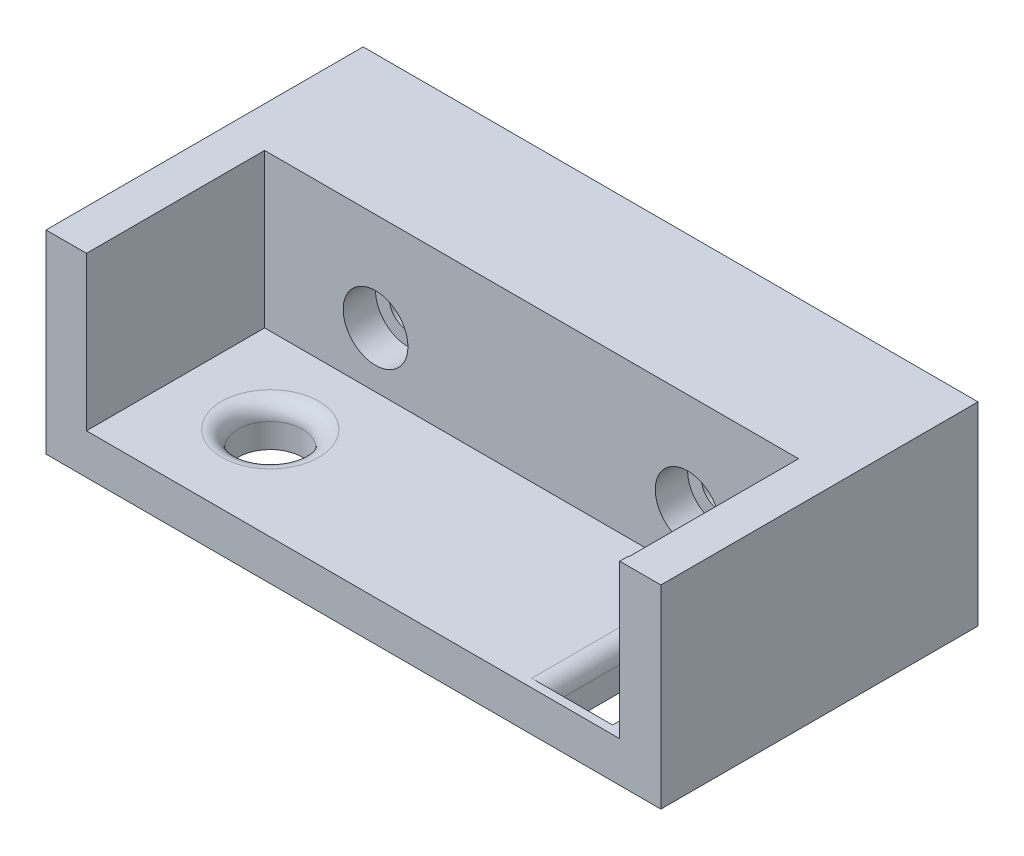
ISO-10303-21;
HEADER;
FILE_DESCRIPTION(('STEP AP214'),'2;1');
FILE_NAME('part.step','',(''),(''),'','','');
FILE_SCHEMA(('AUTOMOTIVE_DESIGN { 1 0 10303 214 1 1 1 1 }'));
ENDSEC;
DATA;
#1=APPLICATION_CONTEXT('core data for automotive mechanical design processes');
#2=APPLICATION_PROTOCOL_DEFINITION('international standard','automotive_design',2000,#1);
#3=PRODUCT_CONTEXT('',#1,'mechanical');
#4=PRODUCT('Part','Part','',(#3));
#5=PRODUCT_RELATED_PRODUCT_CATEGORY('part','',(#4));
#6=PRODUCT_DEFINITION_FORMATION('','',#4);
#7=PRODUCT_DEFINITION_CONTEXT('part definition',#1,'design');
#8=PRODUCT_DEFINITION('design','',#6,#7);
#9=PRODUCT_DEFINITION_SHAPE('','',#8);
#10=(LENGTH_UNIT() NAMED_UNIT(*) SI_UNIT(.MILLI.,.METRE.));
#11=(NAMED_UNIT(*) PLANE_ANGLE_UNIT() SI_UNIT($,.RADIAN.));
#12=(NAMED_UNIT(*) SI_UNIT($,.STERADIAN.) SOLID_ANGLE_UNIT());
#13=UNCERTAINTY_MEASURE_WITH_UNIT(LENGTH_MEASURE(1.E-05),#10,'distance_accuracy_value','');
#14=(GEOMETRIC_REPRESENTATION_CONTEXT(3) GLOBAL_UNCERTAINTY_ASSIGNED_CONTEXT((#13)) GLOBAL_UNIT_ASSIGNED_CONTEXT((#10,
#11,#12)) REPRESENTATION_CONTEXT('',''));
#15=CARTESIAN_POINT('',(0.,0.,0.));
#16=DIRECTION('',(0.,0.,1.));
#17=DIRECTION('',(1.,0.,0.));
#18=AXIS2_PLACEMENT_3D('',#15,#16,#17);
#19=CARTESIAN_POINT('',(-19.2878928169499,6.85176346555883,11.5225387691551));
#20=DIRECTION('',(0.,0.,-1.));
#21=DIRECTION('',(-1.,0.,0.));
#22=AXIS2_PLACEMENT_3D('',#19,#20,#21);
#23=CYLINDRICAL_SURFACE('',#22,2.3);
#24=CARTESIAN_POINT('',(-19.2878928169499,6.85176346555883,-27.6774612308449));
#25=DIRECTION('',(0.,0.,1.));
#26=DIRECTION('',(-1.,0.,0.));
#27=AXIS2_PLACEMENT_3D('',#24,#25,#26);
#28=CIRCLE('',#27,2.3);
#29=CARTESIAN_POINT('',(-21.5878928169499,6.85176346555883,-27.6774612308449));
#30=VERTEX_POINT('',#29);
#31=EDGE_CURVE('E363',#30,#30,#28,.T.);
#32=ORIENTED_EDGE('',*,*,#31,.F.);
#33=EDGE_LOOP('',(#32));
#34=FACE_BOUND('',#33,.T.);
#35=CARTESIAN_POINT('',(-19.2878928169499,6.85176346555883,-14.5));
#36=DIRECTION('',(0.,0.,1.));
#37=DIRECTION('',(1.,0.,0.));
#38=AXIS2_PLACEMENT_3D('',#35,#36,#37);
#39=CIRCLE('',#38,2.3);
#40=CARTESIAN_POINT('',(-16.9878928169499,6.85176346555883,-14.5));
#41=VERTEX_POINT('',#40);
#42=EDGE_CURVE('E44',#41,#41,#39,.T.);
#43=ORIENTED_EDGE('',*,*,#42,.T.);
#44=EDGE_LOOP('',(#43));
#45=FACE_BOUND('',#44,.T.);
#46=ADVANCED_FACE('F40',(#34,#45),#23,.F.);
#47=CARTESIAN_POINT('',(19.2878928169499,6.85176346555883,11.5225387691551));
#48=DIRECTION('',(0.,0.,-1.));
#49=DIRECTION('',(-1.,0.,0.));
#50=AXIS2_PLACEMENT_3D('',#47,#48,#49);
#51=CYLINDRICAL_SURFACE('',#50,2.3);
#52=CARTESIAN_POINT('',(19.2878928169499,6.85176346555883,-27.6774612308449));
#53=DIRECTION('',(0.,0.,1.));
#54=DIRECTION('',(1.,0.,0.));
#55=AXIS2_PLACEMENT_3D('',#52,#53,#54);
#56=CIRCLE('',#55,2.3);
#57=CARTESIAN_POINT('',(21.5878928169499,6.85176346555883,-27.6774612308449));
#58=VERTEX_POINT('',#57);
#59=EDGE_CURVE('E364',#58,#58,#56,.T.);
#60=ORIENTED_EDGE('',*,*,#59,.F.);
#61=EDGE_LOOP('',(#60));
#62=FACE_BOUND('',#61,.T.);
#63=CARTESIAN_POINT('',(19.2878928169499,6.85176346555883,-14.5));
#64=DIRECTION('',(0.,0.,1.));
#65=DIRECTION('',(1.,0.,0.));
#66=AXIS2_PLACEMENT_3D('',#63,#64,#65);
#67=CIRCLE('',#66,2.3);
#68=CARTESIAN_POINT('',(21.5878928169499,6.85176346555883,-14.5));
#69=VERTEX_POINT('',#68);
#70=EDGE_CURVE('E321',#69,#69,#67,.T.);
#71=ORIENTED_EDGE('',*,*,#70,.T.);
#72=EDGE_LOOP('',(#71));
#73=FACE_BOUND('',#72,.T.);
#74=ADVANCED_FACE('F451',(#62,#73),#51,.F.);
#75=CARTESIAN_POINT('',(-33.,19.,10.5));
#76=DIRECTION('',(0.,0.,-1.));
#77=DIRECTION('',(-1.,0.,0.));
#78=AXIS2_PLACEMENT_3D('',#75,#76,#77);
#79=PLANE('',#78);
#80=CARTESIAN_POINT('',(21.,-2.,10.5));
#81=DIRECTION('',(0.,0.,-1.));
#82=DIRECTION('',(-1.,0.,0.));
#83=AXIS2_PLACEMENT_3D('',#80,#81,#82);
#84=CIRCLE('',#83,2.);
#85=CARTESIAN_POINT('',(23.,-2.,10.5));
#86=VERTEX_POINT('',#85);
#87=CARTESIAN_POINT('',(21.,0.,10.5));
#88=VERTEX_POINT('',#87);
#89=EDGE_CURVE('E316',#86,#88,#84,.F.);
#90=ORIENTED_EDGE('',*,*,#89,.T.);
#91=DIRECTION('',(1.,0.,0.));
#92=VECTOR('',#91,1.);
#93=CARTESIAN_POINT('',(-33.,0.,10.5));
#94=LINE('',#93,#92);
#95=CARTESIAN_POINT('',(31.,0.,10.5));
#96=VERTEX_POINT('',#95);
#97=EDGE_CURVE('E350',#88,#96,#94,.T.);
#98=ORIENTED_EDGE('',*,*,#97,.T.);
#99=DIRECTION('',(0.,1.,0.));
#100=VECTOR('',#99,1.);
#101=CARTESIAN_POINT('',(31.,-5.,10.5));
#102=LINE('',#101,#100);
#103=CARTESIAN_POINT('',(31.,-5.,10.5));
#104=VERTEX_POINT('',#103);
#105=EDGE_CURVE('E234',#104,#96,#102,.T.);
#106=ORIENTED_EDGE('',*,*,#105,.F.);
#107=DIRECTION('',(1.,0.,0.));
#108=VECTOR('',#107,1.);
#109=CARTESIAN_POINT('',(23.,-5.,10.5));
#110=LINE('',#109,#108);
#111=CARTESIAN_POINT('',(23.,-5.,10.5));
#112=VERTEX_POINT('',#111);
#113=EDGE_CURVE('E218',#112,#104,#110,.T.);
#114=ORIENTED_EDGE('',*,*,#113,.F.);
#115=DIRECTION('',(0.,1.,0.));
#116=VECTOR('',#115,1.);
#117=CARTESIAN_POINT('',(23.,-5.,10.5));
#118=LINE('',#117,#116);
#119=EDGE_CURVE('E239',#112,#86,#118,.T.);
#120=ORIENTED_EDGE('',*,*,#119,.T.);
#121=EDGE_LOOP('',(#90,#98,#106,#114,#120));
#122=FACE_BOUND('',#121,.T.);
#123=ADVANCED_FACE('F419',(#122),#79,.T.);
#124=CARTESIAN_POINT('',(0.,0.,0.));
#125=DIRECTION('',(0.,1.,0.));
#126=DIRECTION('',(0.,0.,1.));
#127=AXIS2_PLACEMENT_3D('',#124,#125,#126);
#128=PLANE('',#127);
#129=DIRECTION('',(0.,0.,-1.));
#130=VECTOR('',#129,1.);
#131=CARTESIAN_POINT('',(31.,0.,-12.));
#132=LINE('',#131,#130);
#133=CARTESIAN_POINT('',(31.,0.,-10.5));
#134=VERTEX_POINT('',#133);
#135=CARTESIAN_POINT('',(31.,0.,-12.));
#136=VERTEX_POINT('',#135);
#137=EDGE_CURVE('E227',#134,#136,#132,.T.);
#138=ORIENTED_EDGE('',*,*,#137,.F.);
#139=DIRECTION('',(-1.,0.,0.));
#140=VECTOR('',#139,1.);
#141=CARTESIAN_POINT('',(-33.,0.,-10.5));
#142=LINE('',#141,#140);
#143=CARTESIAN_POINT('',(23.,0.,-10.5));
#144=VERTEX_POINT('',#143);
#145=EDGE_CURVE('E278',#134,#144,#142,.T.);
#146=ORIENTED_EDGE('',*,*,#145,.T.);
#147=DIRECTION('',(0.,0.,1.));
#148=VECTOR('',#147,1.);
#149=CARTESIAN_POINT('',(23.,0.,-12.));
#150=LINE('',#149,#148);
#151=CARTESIAN_POINT('',(23.,0.,-12.));
#152=VERTEX_POINT('',#151);
#153=EDGE_CURVE('E210',#152,#144,#150,.T.);
#154=ORIENTED_EDGE('',*,*,#153,.F.);
#155=DIRECTION('',(-1.,0.,0.));
#156=VECTOR('',#155,1.);
#157=CARTESIAN_POINT('',(23.,0.,-12.));
#158=LINE('',#157,#156);
#159=EDGE_CURVE('E226',#136,#152,#158,.T.);
#160=ORIENTED_EDGE('',*,*,#159,.F.);
#161=EDGE_LOOP('',(#138,#146,#154,#160));
#162=FACE_BOUND('',#161,.T.);
#163=ADVANCED_FACE('F430',(#162),#128,.F.);
#164=CARTESIAN_POINT('',(0.,19.,0.));
#165=DIRECTION('',(0.,1.,0.));
#166=DIRECTION('',(0.,0.,1.));
#167=AXIS2_PLACEMENT_3D('',#164,#165,#166);
#168=PLANE('',#167);
#169=DIRECTION('',(-1.,0.,0.));
#170=VECTOR('',#169,1.);
#171=CARTESIAN_POINT('',(-38.,19.,11.5225387691551));
#172=LINE('',#171,#170);
#173=CARTESIAN_POINT('',(-33.,19.,11.5225387691551));
#174=VERTEX_POINT('',#173);
#175=CARTESIAN_POINT('',(-38.,19.,11.5225387691551));
#176=VERTEX_POINT('',#175);
#177=EDGE_CURVE('E174',#174,#176,#172,.T.);
#178=ORIENTED_EDGE('',*,*,#177,.F.);
#179=DIRECTION('',(0.,0.,1.));
#180=VECTOR('',#179,1.);
#181=CARTESIAN_POINT('',(-33.,19.,-10.5));
#182=LINE('',#181,#180);
#183=CARTESIAN_POINT('',(-33.,19.,-10.5));
#184=VERTEX_POINT('',#183);
#185=EDGE_CURVE('E159',#184,#174,#182,.T.);
#186=ORIENTED_EDGE('',*,*,#185,.F.);
#187=DIRECTION('',(-1.,0.,0.));
#188=VECTOR('',#187,1.);
#189=CARTESIAN_POINT('',(-33.,19.,-10.5));
#190=LINE('',#189,#188);
#191=CARTESIAN_POINT('',(33.,19.,-10.5));
#192=VERTEX_POINT('',#191);
#193=EDGE_CURVE('E171',#192,#184,#190,.T.);
#194=ORIENTED_EDGE('',*,*,#193,.F.);
#195=DIRECTION('',(0.,0.,-1.));
#196=VECTOR('',#195,1.);
#197=CARTESIAN_POINT('',(33.,19.,-10.5));
#198=LINE('',#197,#196);
#199=CARTESIAN_POINT('',(33.,19.,10.5));
#200=VERTEX_POINT('',#199);
#201=EDGE_CURVE('E261',#200,#192,#198,.T.);
#202=ORIENTED_EDGE('',*,*,#201,.F.);
#203=DIRECTION('',(1.,0.,0.));
#204=VECTOR('',#203,1.);
#205=CARTESIAN_POINT('',(-33.,19.,10.5));
#206=LINE('',#205,#204);
#207=CARTESIAN_POINT('',(32.9119548306093,19.,10.5));
#208=VERTEX_POINT('',#207);
#209=EDGE_CURVE('E170',#208,#200,#206,.T.);
#210=ORIENTED_EDGE('',*,*,#209,.F.);
#211=DIRECTION('',(0.,0.,-1.));
#212=VECTOR('',#211,1.);
#213=CARTESIAN_POINT('',(32.9119548306093,19.,10.5));
#214=LINE('',#213,#212);
#215=CARTESIAN_POINT('',(32.9119548306093,19.,11.5225387691551));
#216=VERTEX_POINT('',#215);
#217=EDGE_CURVE('E179',#216,#208,#214,.T.);
#218=ORIENTED_EDGE('',*,*,#217,.F.);
#219=CARTESIAN_POINT('',(38.,19.,11.5225387691551));
#220=VERTEX_POINT('',#219);
#221=EDGE_CURVE('E186',#220,#216,#172,.T.);
#222=ORIENTED_EDGE('',*,*,#221,.F.);
#223=DIRECTION('',(0.,0.,-1.));
#224=VECTOR('',#223,1.);
#225=CARTESIAN_POINT('',(38.,19.,-15.5));
#226=LINE('',#225,#224);
#227=CARTESIAN_POINT('',(38.,19.,-27.6774612308449));
#228=VERTEX_POINT('',#227);
#229=EDGE_CURVE('E292',#220,#228,#226,.T.);
#230=ORIENTED_EDGE('',*,*,#229,.T.);
#231=DIRECTION('',(-1.,0.,0.));
#232=VECTOR('',#231,1.);
#233=CARTESIAN_POINT('',(-38.,19.,-27.6774612308449));
#234=LINE('',#233,#232);
#235=CARTESIAN_POINT('',(-38.,19.,-27.6774612308449));
#236=VERTEX_POINT('',#235);
#237=EDGE_CURVE('E187',#228,#236,#234,.T.);
#238=ORIENTED_EDGE('',*,*,#237,.T.);
#239=DIRECTION('',(0.,0.,1.));
#240=VECTOR('',#239,1.);
#241=CARTESIAN_POINT('',(-38.,19.,-15.5));
#242=LINE('',#241,#240);
#243=EDGE_CURVE('E184',#236,#176,#242,.T.);
#244=ORIENTED_EDGE('',*,*,#243,.T.);
#245=EDGE_LOOP('',(#178,#186,#194,#202,#210,#218,#222,#230,#238,#244));
#246=FACE_BOUND('',#245,.T.);
#247=ADVANCED_FACE('F182',(#246),#168,.T.);
#248=CARTESIAN_POINT('',(38.,19.,-15.5));
#249=DIRECTION('',(-1.,0.,0.));
#250=DIRECTION('',(0.,0.,1.));
#251=AXIS2_PLACEMENT_3D('',#248,#249,#250);
#252=PLANE('',#251);
#253=ORIENTED_EDGE('',*,*,#229,.F.);
#254=DIRECTION('',(0.,-1.,0.));
#255=VECTOR('',#254,1.);
#256=CARTESIAN_POINT('',(38.,19.,11.5225387691551));
#257=LINE('',#256,#255);
#258=CARTESIAN_POINT('',(38.,-5.,11.5225387691551));
#259=VERTEX_POINT('',#258);
#260=EDGE_CURVE('E200',#220,#259,#257,.T.);
#261=ORIENTED_EDGE('',*,*,#260,.T.);
#262=DIRECTION('',(0.,0.,-1.));
#263=VECTOR('',#262,1.);
#264=CARTESIAN_POINT('',(38.,-5.,-15.5));
#265=LINE('',#264,#263);
#266=CARTESIAN_POINT('',(38.,-5.,-27.6774612308449));
#267=VERTEX_POINT('',#266);
#268=EDGE_CURVE('E253',#259,#267,#265,.T.);
#269=ORIENTED_EDGE('',*,*,#268,.T.);
#270=DIRECTION('',(0.,1.,0.));
#271=VECTOR('',#270,1.);
#272=CARTESIAN_POINT('',(38.,19.,-27.6774612308449));
#273=LINE('',#272,#271);
#274=EDGE_CURVE('E192',#267,#228,#273,.T.);
#275=ORIENTED_EDGE('',*,*,#274,.T.);
#276=EDGE_LOOP('',(#253,#261,#269,#275));
#277=FACE_BOUND('',#276,.T.);
#278=ADVANCED_FACE('F390',(#277),#252,.F.);
#279=CARTESIAN_POINT('',(-38.,19.,-15.5));
#280=DIRECTION('',(1.,0.,0.));
#281=DIRECTION('',(0.,0.,-1.));
#282=AXIS2_PLACEMENT_3D('',#279,#280,#281);
#283=PLANE('',#282);
#284=DIRECTION('',(0.,0.,1.));
#285=VECTOR('',#284,1.);
#286=CARTESIAN_POINT('',(-38.,-5.,-15.5));
#287=LINE('',#286,#285);
#288=CARTESIAN_POINT('',(-38.,-5.,-27.6774612308449));
#289=VERTEX_POINT('',#288);
#290=CARTESIAN_POINT('',(-38.,-5.,11.5225387691551));
#291=VERTEX_POINT('',#290);
#292=EDGE_CURVE('E256',#289,#291,#287,.T.);
#293=ORIENTED_EDGE('',*,*,#292,.T.);
#294=DIRECTION('',(0.,1.,0.));
#295=VECTOR('',#294,1.);
#296=CARTESIAN_POINT('',(-38.,-5.,11.5225387691551));
#297=LINE('',#296,#295);
#298=EDGE_CURVE('E66',#291,#176,#297,.T.);
#299=ORIENTED_EDGE('',*,*,#298,.T.);
#300=ORIENTED_EDGE('',*,*,#243,.F.);
#301=DIRECTION('',(0.,-1.,0.));
#302=VECTOR('',#301,1.);
#303=CARTESIAN_POINT('',(-38.,19.,-27.6774612308449));
#304=LINE('',#303,#302);
#305=EDGE_CURVE('E196',#236,#289,#304,.T.);
#306=ORIENTED_EDGE('',*,*,#305,.T.);
#307=EDGE_LOOP('',(#293,#299,#300,#306));
#308=FACE_BOUND('',#307,.T.);
#309=ADVANCED_FACE('F384',(#308),#283,.F.);
#310=CARTESIAN_POINT('',(33.,19.,-10.5));
#311=DIRECTION('',(-1.,0.,0.));
#312=DIRECTION('',(0.,0.,1.));
#313=AXIS2_PLACEMENT_3D('',#310,#311,#312);
#314=PLANE('',#313);
#315=DIRECTION('',(0.,0.,-1.));
#316=VECTOR('',#315,1.);
#317=CARTESIAN_POINT('',(33.,0.,-10.5));
#318=LINE('',#317,#316);
#319=CARTESIAN_POINT('',(33.,0.,10.5));
#320=VERTEX_POINT('',#319);
#321=CARTESIAN_POINT('',(33.,0.,-10.5));
#322=VERTEX_POINT('',#321);
#323=EDGE_CURVE('E260',#320,#322,#318,.T.);
#324=ORIENTED_EDGE('',*,*,#323,.F.);
#325=DIRECTION('',(0.,-1.,0.));
#326=VECTOR('',#325,1.);
#327=CARTESIAN_POINT('',(33.,19.,10.5));
#328=LINE('',#327,#326);
#329=EDGE_CURVE('E269',#200,#320,#328,.T.);
#330=ORIENTED_EDGE('',*,*,#329,.F.);
#331=ORIENTED_EDGE('',*,*,#201,.T.);
#332=DIRECTION('',(0.,-1.,0.));
#333=VECTOR('',#332,1.);
#334=CARTESIAN_POINT('',(33.,19.,-10.5));
#335=LINE('',#334,#333);
#336=EDGE_CURVE('E288',#192,#322,#335,.T.);
#337=ORIENTED_EDGE('',*,*,#336,.T.);
#338=EDGE_LOOP('',(#324,#330,#331,#337));
#339=FACE_BOUND('',#338,.T.);
#340=ADVANCED_FACE('F406',(#339),#314,.T.);
#341=CARTESIAN_POINT('',(-33.,19.,-10.5));
#342=DIRECTION('',(0.,0.,1.));
#343=DIRECTION('',(1.,0.,0.));
#344=AXIS2_PLACEMENT_3D('',#341,#342,#343);
#345=PLANE('',#344);
#346=CARTESIAN_POINT('',(-19.2878928169499,6.85176346555883,-10.5));
#347=DIRECTION('',(0.,0.,1.));
#348=DIRECTION('',(1.,0.,0.));
#349=AXIS2_PLACEMENT_3D('',#346,#347,#348);
#350=CIRCLE('',#349,4.);
#351=CARTESIAN_POINT('',(-15.2878928169499,6.85176346555883,-10.5));
#352=VERTEX_POINT('',#351);
#353=EDGE_CURVE('E331',#352,#352,#350,.T.);
#354=ORIENTED_EDGE('',*,*,#353,.F.);
#355=EDGE_LOOP('',(#354));
#356=FACE_BOUND('',#355,.T.);
#357=CARTESIAN_POINT('',(19.2878928169499,6.85176346555883,-10.5));
#358=DIRECTION('',(0.,0.,1.));
#359=DIRECTION('',(1.,0.,0.));
#360=AXIS2_PLACEMENT_3D('',#357,#358,#359);
#361=CIRCLE('',#360,4.);
#362=CARTESIAN_POINT('',(23.2878928169499,6.85176346555883,-10.5));
#363=VERTEX_POINT('',#362);
#364=EDGE_CURVE('E343',#363,#363,#361,.T.);
#365=ORIENTED_EDGE('',*,*,#364,.F.);
#366=EDGE_LOOP('',(#365));
#367=FACE_BOUND('',#366,.T.);
#368=EDGE_CURVE('E274',#322,#134,#142,.T.);
#369=ORIENTED_EDGE('',*,*,#368,.F.);
#370=ORIENTED_EDGE('',*,*,#336,.F.);
#371=ORIENTED_EDGE('',*,*,#193,.T.);
#372=DIRECTION('',(0.,-1.,0.));
#373=VECTOR('',#372,1.);
#374=CARTESIAN_POINT('',(-33.,19.,-10.5));
#375=LINE('',#374,#373);
#376=CARTESIAN_POINT('',(-33.,0.,-10.5));
#377=VERTEX_POINT('',#376);
#378=EDGE_CURVE('E165',#184,#377,#375,.T.);
#379=ORIENTED_EDGE('',*,*,#378,.T.);
#380=CARTESIAN_POINT('',(21.,0.,-10.5));
#381=VERTEX_POINT('',#380);
#382=EDGE_CURVE('E273',#381,#377,#142,.T.);
#383=ORIENTED_EDGE('',*,*,#382,.F.);
#384=CARTESIAN_POINT('',(21.,-2.,-10.5));
#385=DIRECTION('',(0.,0.,1.));
#386=DIRECTION('',(1.,0.,0.));
#387=AXIS2_PLACEMENT_3D('',#384,#385,#386);
#388=CIRCLE('',#387,2.);
#389=CARTESIAN_POINT('',(23.,-2.,-10.5));
#390=VERTEX_POINT('',#389);
#391=EDGE_CURVE('E50',#381,#390,#388,.F.);
#392=ORIENTED_EDGE('',*,*,#391,.T.);
#393=DIRECTION('',(0.,-1.,0.));
#394=VECTOR('',#393,1.);
#395=CARTESIAN_POINT('',(23.,19.,-10.5));
#396=LINE('',#395,#394);
#397=EDGE_CURVE('E305',#144,#390,#396,.T.);
#398=ORIENTED_EDGE('',*,*,#397,.F.);
#399=ORIENTED_EDGE('',*,*,#145,.F.);
#400=EDGE_LOOP('',(#369,#370,#371,#379,#383,#392,#398,#399));
#401=FACE_BOUND('',#400,.T.);
#402=ADVANCED_FACE('F409',(#356,#367,#401),#345,.T.);
#403=CARTESIAN_POINT('',(-33.,19.,-10.5));
#404=DIRECTION('',(1.,0.,0.));
#405=DIRECTION('',(0.,0.,-1.));
#406=AXIS2_PLACEMENT_3D('',#403,#404,#405);
#407=PLANE('',#406);
#408=DIRECTION('',(0.,0.,1.));
#409=VECTOR('',#408,1.);
#410=CARTESIAN_POINT('',(-33.,0.,-10.5));
#411=LINE('',#410,#409);
#412=CARTESIAN_POINT('',(-33.,0.,11.5225387691551));
#413=VERTEX_POINT('',#412);
#414=EDGE_CURVE('E58',#377,#413,#411,.T.);
#415=ORIENTED_EDGE('',*,*,#414,.F.);
#416=ORIENTED_EDGE('',*,*,#378,.F.);
#417=ORIENTED_EDGE('',*,*,#185,.T.);
#418=DIRECTION('',(0.,1.,0.));
#419=VECTOR('',#418,1.);
#420=CARTESIAN_POINT('',(-33.,-65.9198860369669,11.5225387691551));
#421=LINE('',#420,#419);
#422=EDGE_CURVE('E162',#413,#174,#421,.T.);
#423=ORIENTED_EDGE('',*,*,#422,.F.);
#424=EDGE_LOOP('',(#415,#416,#417,#423));
#425=FACE_BOUND('',#424,.T.);
#426=ADVANCED_FACE('F161',(#425),#407,.T.);
#427=DIRECTION('',(0.,1.,0.));
#428=VECTOR('',#427,1.);
#429=CARTESIAN_POINT('',(32.9119548306093,-65.9198860369669,10.5));
#430=LINE('',#429,#428);
#431=CARTESIAN_POINT('',(32.9119548306093,0.,10.5));
#432=VERTEX_POINT('',#431);
#433=EDGE_CURVE('E351',#432,#208,#430,.T.);
#434=ORIENTED_EDGE('',*,*,#433,.T.);
#435=ORIENTED_EDGE('',*,*,#209,.T.);
#436=ORIENTED_EDGE('',*,*,#329,.T.);
#437=DIRECTION('',(1.,0.,0.));
#438=VECTOR('',#437,1.);
#439=CARTESIAN_POINT('',(-33.,0.,10.5));
#440=LINE('',#439,#438);
#441=EDGE_CURVE('E264',#432,#320,#440,.T.);
#442=ORIENTED_EDGE('',*,*,#441,.F.);
#443=EDGE_LOOP('',(#434,#435,#436,#442));
#444=FACE_BOUND('',#443,.T.);
#445=ADVANCED_FACE('F401',(#444),#79,.T.);
#446=CARTESIAN_POINT('',(0.,0.,0.));
#447=DIRECTION('',(0.,1.,0.));
#448=DIRECTION('',(0.,0.,1.));
#449=AXIS2_PLACEMENT_3D('',#446,#447,#448);
#450=PLANE('',#449);
#451=CARTESIAN_POINT('',(-21.8,0.,0.));
#452=DIRECTION('',(0.,1.,0.));
#453=DIRECTION('',(0.,0.,1.));
#454=AXIS2_PLACEMENT_3D('',#451,#452,#453);
#455=CIRCLE('',#454,6.);
#456=CARTESIAN_POINT('',(-21.8,0.,6.));
#457=VERTEX_POINT('',#456);
#458=EDGE_CURVE('E301',#457,#457,#455,.F.);
#459=ORIENTED_EDGE('',*,*,#458,.T.);
#460=EDGE_LOOP('',(#459));
#461=FACE_BOUND('',#460,.T.);
#462=ORIENTED_EDGE('',*,*,#414,.T.);
#463=DIRECTION('',(-1.,0.,0.));
#464=VECTOR('',#463,1.);
#465=CARTESIAN_POINT('',(-33.,0.,11.5225387691551));
#466=LINE('',#465,#464);
#467=CARTESIAN_POINT('',(32.9119548306093,0.,11.5225387691551));
#468=VERTEX_POINT('',#467);
#469=EDGE_CURVE('E176',#468,#413,#466,.T.);
#470=ORIENTED_EDGE('',*,*,#469,.F.);
#471=DIRECTION('',(0.,0.,1.));
#472=VECTOR('',#471,1.);
#473=CARTESIAN_POINT('',(32.9119548306093,0.,10.5));
#474=LINE('',#473,#472);
#475=EDGE_CURVE('E347',#432,#468,#474,.T.);
#476=ORIENTED_EDGE('',*,*,#475,.F.);
#477=ORIENTED_EDGE('',*,*,#441,.T.);
#478=ORIENTED_EDGE('',*,*,#323,.T.);
#479=ORIENTED_EDGE('',*,*,#368,.T.);
#480=EDGE_CURVE('E204',#96,#134,#132,.T.);
#481=ORIENTED_EDGE('',*,*,#480,.F.);
#482=ORIENTED_EDGE('',*,*,#97,.F.);
#483=DIRECTION('',(0.,0.,1.));
#484=VECTOR('',#483,1.);
#485=CARTESIAN_POINT('',(21.,0.,-10.5));
#486=LINE('',#485,#484);
#487=EDGE_CURVE('E313',#88,#381,#486,.F.);
#488=ORIENTED_EDGE('',*,*,#487,.T.);
#489=ORIENTED_EDGE('',*,*,#382,.T.);
#490=EDGE_LOOP('',(#462,#470,#476,#477,#478,#479,#481,#482,#488,#489));
#491=FACE_BOUND('',#490,.T.);
#492=ADVANCED_FACE('F404',(#461,#491),#450,.T.);
#493=CARTESIAN_POINT('',(0.,-5.,0.));
#494=DIRECTION('',(0.,1.,0.));
#495=DIRECTION('',(0.,0.,1.));
#496=AXIS2_PLACEMENT_3D('',#493,#494,#495);
#497=PLANE('',#496);
#498=ORIENTED_EDGE('',*,*,#113,.T.);
#499=DIRECTION('',(0.,0.,-1.));
#500=VECTOR('',#499,1.);
#501=CARTESIAN_POINT('',(31.,-5.,-12.));
#502=LINE('',#501,#500);
#503=CARTESIAN_POINT('',(31.,-5.,-12.));
#504=VERTEX_POINT('',#503);
#505=EDGE_CURVE('E205',#104,#504,#502,.T.);
#506=ORIENTED_EDGE('',*,*,#505,.T.);
#507=DIRECTION('',(-1.,0.,0.));
#508=VECTOR('',#507,1.);
#509=CARTESIAN_POINT('',(23.,-5.,-12.));
#510=LINE('',#509,#508);
#511=CARTESIAN_POINT('',(23.,-5.,-12.));
#512=VERTEX_POINT('',#511);
#513=EDGE_CURVE('E209',#504,#512,#510,.T.);
#514=ORIENTED_EDGE('',*,*,#513,.T.);
#515=DIRECTION('',(0.,0.,1.));
#516=VECTOR('',#515,1.);
#517=CARTESIAN_POINT('',(23.,-5.,-12.));
#518=LINE('',#517,#516);
#519=EDGE_CURVE('E214',#512,#112,#518,.T.);
#520=ORIENTED_EDGE('',*,*,#519,.T.);
#521=EDGE_LOOP('',(#498,#506,#514,#520));
#522=FACE_BOUND('',#521,.T.);
#523=CARTESIAN_POINT('',(-21.8,-5.,0.));
#524=DIRECTION('',(0.,1.,0.));
#525=DIRECTION('',(0.,0.,1.));
#526=AXIS2_PLACEMENT_3D('',#523,#524,#525);
#527=CIRCLE('',#526,4.);
#528=CARTESIAN_POINT('',(-21.8,-5.,4.));
#529=VERTEX_POINT('',#528);
#530=EDGE_CURVE('E238',#529,#529,#527,.T.);
#531=ORIENTED_EDGE('',*,*,#530,.T.);
#532=EDGE_LOOP('',(#531));
#533=FACE_BOUND('',#532,.T.);
#534=ORIENTED_EDGE('',*,*,#268,.F.);
#535=DIRECTION('',(-1.,0.,0.));
#536=VECTOR('',#535,1.);
#537=CARTESIAN_POINT('',(0.,-5.,11.5225387691551));
#538=LINE('',#537,#536);
#539=EDGE_CURVE('E11',#259,#291,#538,.T.);
#540=ORIENTED_EDGE('',*,*,#539,.T.);
#541=ORIENTED_EDGE('',*,*,#292,.F.);
#542=DIRECTION('',(1.,0.,0.));
#543=VECTOR('',#542,1.);
#544=CARTESIAN_POINT('',(-38.,-5.,-27.6774612308449));
#545=LINE('',#544,#543);
#546=EDGE_CURVE('E373',#289,#267,#545,.T.);
#547=ORIENTED_EDGE('',*,*,#546,.T.);
#548=EDGE_LOOP('',(#534,#540,#541,#547));
#549=FACE_BOUND('',#548,.T.);
#550=ADVANCED_FACE('F391',(#522,#533,#549),#497,.F.);
#551=CARTESIAN_POINT('',(-21.8,-5.,0.));
#552=DIRECTION('',(0.,1.,0.));
#553=DIRECTION('',(0.,0.,1.));
#554=AXIS2_PLACEMENT_3D('',#551,#552,#553);
#555=CYLINDRICAL_SURFACE('',#554,4.);
#556=CARTESIAN_POINT('',(-21.8,-2.,0.));
#557=DIRECTION('',(0.,1.,0.));
#558=DIRECTION('',(0.,0.,1.));
#559=AXIS2_PLACEMENT_3D('',#556,#557,#558);
#560=CIRCLE('',#559,4.);
#561=CARTESIAN_POINT('',(-21.8,-2.,4.));
#562=VERTEX_POINT('',#561);
#563=EDGE_CURVE('E297',#562,#562,#560,.T.);
#564=ORIENTED_EDGE('',*,*,#563,.T.);
#565=EDGE_LOOP('',(#564));
#566=FACE_BOUND('',#565,.T.);
#567=ORIENTED_EDGE('',*,*,#530,.F.);
#568=EDGE_LOOP('',(#567));
#569=FACE_BOUND('',#568,.T.);
#570=ADVANCED_FACE('F439',(#566,#569),#555,.F.);
#571=CARTESIAN_POINT('',(31.,-5.,-12.));
#572=DIRECTION('',(1.,0.,0.));
#573=DIRECTION('',(0.,0.,-1.));
#574=AXIS2_PLACEMENT_3D('',#571,#572,#573);
#575=PLANE('',#574);
#576=ORIENTED_EDGE('',*,*,#480,.T.);
#577=ORIENTED_EDGE('',*,*,#137,.T.);
#578=DIRECTION('',(0.,1.,0.));
#579=VECTOR('',#578,1.);
#580=CARTESIAN_POINT('',(31.,-5.,-12.));
#581=LINE('',#580,#579);
#582=EDGE_CURVE('E222',#504,#136,#581,.T.);
#583=ORIENTED_EDGE('',*,*,#582,.F.);
#584=ORIENTED_EDGE('',*,*,#505,.F.);
#585=ORIENTED_EDGE('',*,*,#105,.T.);
#586=EDGE_LOOP('',(#576,#577,#583,#584,#585));
#587=FACE_BOUND('',#586,.T.);
#588=ADVANCED_FACE('F415',(#587),#575,.F.);
#589=CARTESIAN_POINT('',(23.,-5.,-12.));
#590=DIRECTION('',(-1.,0.,0.));
#591=DIRECTION('',(0.,0.,1.));
#592=AXIS2_PLACEMENT_3D('',#589,#590,#591);
#593=PLANE('',#592);
#594=ORIENTED_EDGE('',*,*,#397,.T.);
#595=DIRECTION('',(0.,0.,1.));
#596=VECTOR('',#595,1.);
#597=CARTESIAN_POINT('',(23.,-2.,10.5));
#598=LINE('',#597,#596);
#599=EDGE_CURVE('E309',#390,#86,#598,.T.);
#600=ORIENTED_EDGE('',*,*,#599,.T.);
#601=ORIENTED_EDGE('',*,*,#119,.F.);
#602=ORIENTED_EDGE('',*,*,#519,.F.);
#603=DIRECTION('',(0.,1.,0.));
#604=VECTOR('',#603,1.);
#605=CARTESIAN_POINT('',(23.,-5.,-12.));
#606=LINE('',#605,#604);
#607=EDGE_CURVE('E243',#512,#152,#606,.T.);
#608=ORIENTED_EDGE('',*,*,#607,.T.);
#609=ORIENTED_EDGE('',*,*,#153,.T.);
#610=EDGE_LOOP('',(#594,#600,#601,#602,#608,#609));
#611=FACE_BOUND('',#610,.T.);
#612=ADVANCED_FACE('F427',(#611),#593,.F.);
#613=CARTESIAN_POINT('',(23.,-5.,-12.));
#614=DIRECTION('',(0.,0.,-1.));
#615=DIRECTION('',(-1.,0.,0.));
#616=AXIS2_PLACEMENT_3D('',#613,#614,#615);
#617=PLANE('',#616);
#618=ORIENTED_EDGE('',*,*,#159,.T.);
#619=ORIENTED_EDGE('',*,*,#607,.F.);
#620=ORIENTED_EDGE('',*,*,#513,.F.);
#621=ORIENTED_EDGE('',*,*,#582,.T.);
#622=EDGE_LOOP('',(#618,#619,#620,#621));
#623=FACE_BOUND('',#622,.T.);
#624=ADVANCED_FACE('F434',(#623),#617,.F.);
#625=CARTESIAN_POINT('',(-21.8,-2.,0.));
#626=DIRECTION('',(0.,1.,0.));
#627=DIRECTION('',(0.,0.,1.));
#628=AXIS2_PLACEMENT_3D('',#625,#626,#627);
#629=TOROIDAL_SURFACE('',#628,6.,2.);
#630=ORIENTED_EDGE('',*,*,#458,.F.);
#631=EDGE_LOOP('',(#630));
#632=FACE_BOUND('',#631,.T.);
#633=ORIENTED_EDGE('',*,*,#563,.F.);
#634=EDGE_LOOP('',(#633));
#635=FACE_BOUND('',#634,.T.);
#636=ADVANCED_FACE('F472',(#632,#635),#629,.T.);
#637=CARTESIAN_POINT('',(21.,-2.,-12.));
#638=DIRECTION('',(0.,0.,-1.));
#639=DIRECTION('',(-1.,0.,0.));
#640=AXIS2_PLACEMENT_3D('',#637,#638,#639);
#641=CYLINDRICAL_SURFACE('',#640,2.);
#642=ORIENTED_EDGE('',*,*,#391,.F.);
#643=ORIENTED_EDGE('',*,*,#487,.F.);
#644=ORIENTED_EDGE('',*,*,#89,.F.);
#645=ORIENTED_EDGE('',*,*,#599,.F.);
#646=EDGE_LOOP('',(#642,#643,#644,#645));
#647=FACE_BOUND('',#646,.T.);
#648=ADVANCED_FACE('F42',(#647),#641,.T.);
#649=CARTESIAN_POINT('',(-38.,-5.,11.5225387691551));
#650=DIRECTION('',(0.,0.,-1.));
#651=DIRECTION('',(-1.,0.,0.));
#652=AXIS2_PLACEMENT_3D('',#649,#650,#651);
#653=PLANE('',#652);
#654=ORIENTED_EDGE('',*,*,#469,.T.);
#655=ORIENTED_EDGE('',*,*,#422,.T.);
#656=ORIENTED_EDGE('',*,*,#177,.T.);
#657=ORIENTED_EDGE('',*,*,#298,.F.);
#658=ORIENTED_EDGE('',*,*,#539,.F.);
#659=ORIENTED_EDGE('',*,*,#260,.F.);
#660=ORIENTED_EDGE('',*,*,#221,.T.);
#661=DIRECTION('',(0.,1.,0.));
#662=VECTOR('',#661,1.);
#663=CARTESIAN_POINT('',(32.9119548306093,-65.9198860369669,11.5225387691551));
#664=LINE('',#663,#662);
#665=EDGE_CURVE('E178',#468,#216,#664,.T.);
#666=ORIENTED_EDGE('',*,*,#665,.F.);
#667=EDGE_LOOP('',(#654,#655,#656,#657,#658,#659,#660,#666));
#668=FACE_BOUND('',#667,.T.);
#669=ADVANCED_FACE('F173',(#668),#653,.F.);
#670=CARTESIAN_POINT('',(0.,0.,-27.6774612308449));
#671=DIRECTION('',(0.,0.,1.));
#672=DIRECTION('',(1.,0.,0.));
#673=AXIS2_PLACEMENT_3D('',#670,#671,#672);
#674=PLANE('',#673);
#675=ORIENTED_EDGE('',*,*,#59,.T.);
#676=EDGE_LOOP('',(#675));
#677=FACE_BOUND('',#676,.T.);
#678=ORIENTED_EDGE('',*,*,#31,.T.);
#679=EDGE_LOOP('',(#678));
#680=FACE_BOUND('',#679,.T.);
#681=ORIENTED_EDGE('',*,*,#305,.F.);
#682=ORIENTED_EDGE('',*,*,#237,.F.);
#683=ORIENTED_EDGE('',*,*,#274,.F.);
#684=ORIENTED_EDGE('',*,*,#546,.F.);
#685=EDGE_LOOP('',(#681,#682,#683,#684));
#686=FACE_BOUND('',#685,.T.);
#687=ADVANCED_FACE('F387',(#677,#680,#686),#674,.F.);
#688=CARTESIAN_POINT('',(32.9119548306093,-65.9198860369669,10.5));
#689=DIRECTION('',(1.,0.,0.));
#690=DIRECTION('',(0.,0.,-1.));
#691=AXIS2_PLACEMENT_3D('',#688,#689,#690);
#692=PLANE('',#691);
#693=ORIENTED_EDGE('',*,*,#475,.T.);
#694=ORIENTED_EDGE('',*,*,#665,.T.);
#695=ORIENTED_EDGE('',*,*,#217,.T.);
#696=ORIENTED_EDGE('',*,*,#433,.F.);
#697=EDGE_LOOP('',(#693,#694,#695,#696));
#698=FACE_BOUND('',#697,.T.);
#699=ADVANCED_FACE('F398',(#698),#692,.F.);
#700=CARTESIAN_POINT('',(19.2878928169499,6.85176346555883,-14.5));
#701=DIRECTION('',(0.,0.,1.));
#702=DIRECTION('',(1.,0.,0.));
#703=AXIS2_PLACEMENT_3D('',#700,#701,#702);
#704=CYLINDRICAL_SURFACE('',#703,4.);
#705=CARTESIAN_POINT('',(19.2878928169499,6.85176346555883,-14.5));
#706=DIRECTION('',(0.,0.,1.));
#707=DIRECTION('',(1.,0.,0.));
#708=AXIS2_PLACEMENT_3D('',#705,#706,#707);
#709=CIRCLE('',#708,4.);
#710=CARTESIAN_POINT('',(23.2878928169499,6.85176346555883,-14.5));
#711=VERTEX_POINT('',#710);
#712=EDGE_CURVE('E337',#711,#711,#709,.T.);
#713=ORIENTED_EDGE('',*,*,#712,.F.);
#714=EDGE_LOOP('',(#713));
#715=FACE_BOUND('',#714,.T.);
#716=ORIENTED_EDGE('',*,*,#364,.T.);
#717=EDGE_LOOP('',(#716));
#718=FACE_BOUND('',#717,.T.);
#719=ADVANCED_FACE('F606',(#715,#718),#704,.F.);
#720=CARTESIAN_POINT('',(19.2878928169499,6.85176346555883,-14.5));
#721=DIRECTION('',(0.,0.,1.));
#722=DIRECTION('',(1.,0.,0.));
#723=AXIS2_PLACEMENT_3D('',#720,#721,#722);
#724=PLANE('',#723);
#725=ORIENTED_EDGE('',*,*,#70,.F.);
#726=EDGE_LOOP('',(#725));
#727=FACE_BOUND('',#726,.T.);
#728=ORIENTED_EDGE('',*,*,#712,.T.);
#729=EDGE_LOOP('',(#728));
#730=FACE_BOUND('',#729,.T.);
#731=ADVANCED_FACE('F624',(#727,#730),#724,.T.);
#732=CARTESIAN_POINT('',(-19.2878928169499,6.85176346555883,-14.5));
#733=DIRECTION('',(0.,0.,1.));
#734=DIRECTION('',(1.,0.,0.));
#735=AXIS2_PLACEMENT_3D('',#732,#733,#734);
#736=CYLINDRICAL_SURFACE('',#735,4.);
#737=CARTESIAN_POINT('',(-19.2878928169499,6.85176346555883,-14.5));
#738=DIRECTION('',(0.,0.,1.));
#739=DIRECTION('',(1.,0.,0.));
#740=AXIS2_PLACEMENT_3D('',#737,#738,#739);
#741=CIRCLE('',#740,4.);
#742=CARTESIAN_POINT('',(-15.2878928169499,6.85176346555883,-14.5));
#743=VERTEX_POINT('',#742);
#744=EDGE_CURVE('E324',#743,#743,#741,.T.);
#745=ORIENTED_EDGE('',*,*,#744,.F.);
#746=EDGE_LOOP('',(#745));
#747=FACE_BOUND('',#746,.T.);
#748=ORIENTED_EDGE('',*,*,#353,.T.);
#749=EDGE_LOOP('',(#748));
#750=FACE_BOUND('',#749,.T.);
#751=ADVANCED_FACE('F631',(#747,#750),#736,.F.);
#752=CARTESIAN_POINT('',(-19.2878928169499,6.85176346555883,-14.5));
#753=DIRECTION('',(0.,0.,1.));
#754=DIRECTION('',(1.,0.,0.));
#755=AXIS2_PLACEMENT_3D('',#752,#753,#754);
#756=PLANE('',#755);
#757=ORIENTED_EDGE('',*,*,#42,.F.);
#758=EDGE_LOOP('',(#757));
#759=FACE_BOUND('',#758,.T.);
#760=ORIENTED_EDGE('',*,*,#744,.T.);
#761=EDGE_LOOP('',(#760));
#762=FACE_BOUND('',#761,.T.);
#763=ADVANCED_FACE('F639',(#759,#762),#756,.T.);
#764=CLOSED_SHELL('',(#46,#74,#123,#163,#247,#278,#309,#340,#402,#426,#445,#492,#550,#570,#588,
#612,#624,#636,#648,#669,#687,#699,#719,#731,#751,#763));
#765=MANIFOLD_SOLID_BREP('B2',#764);
#766=ADVANCED_BREP_SHAPE_REPRESENTATION('',(#18,#765),#14);
#767=SHAPE_DEFINITION_REPRESENTATION(#9,#766);
ENDSEC;
END-ISO-10303-21;
